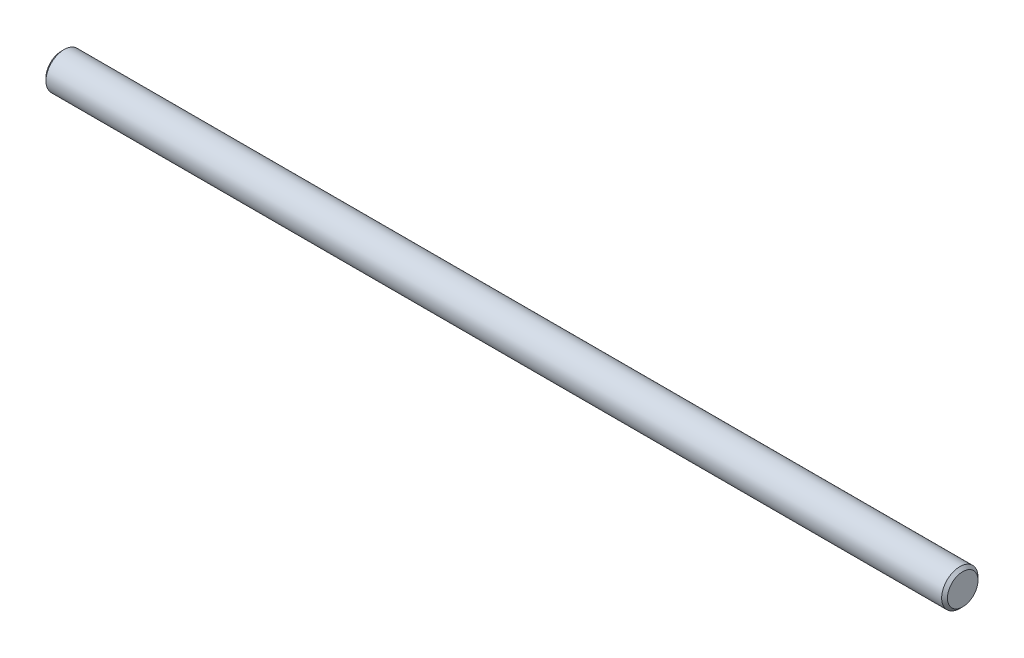
ISO-10303-21;
HEADER;
FILE_DESCRIPTION(('STEP AP214'),'2;1');
FILE_NAME('part.step','',(''),(''),'','','');
FILE_SCHEMA(('AUTOMOTIVE_DESIGN { 1 0 10303 214 1 1 1 1 }'));
ENDSEC;
DATA;
#1=APPLICATION_CONTEXT('core data for automotive mechanical design processes');
#2=APPLICATION_PROTOCOL_DEFINITION('international standard','automotive_design',2000,#1);
#3=PRODUCT_CONTEXT('',#1,'mechanical');
#4=PRODUCT('Part','Part','',(#3));
#5=PRODUCT_RELATED_PRODUCT_CATEGORY('part','',(#4));
#6=PRODUCT_DEFINITION_FORMATION('','',#4);
#7=PRODUCT_DEFINITION_CONTEXT('part definition',#1,'design');
#8=PRODUCT_DEFINITION('design','',#6,#7);
#9=PRODUCT_DEFINITION_SHAPE('','',#8);
#10=(LENGTH_UNIT() NAMED_UNIT(*) SI_UNIT(.MILLI.,.METRE.));
#11=(NAMED_UNIT(*) PLANE_ANGLE_UNIT() SI_UNIT($,.RADIAN.));
#12=(NAMED_UNIT(*) SI_UNIT($,.STERADIAN.) SOLID_ANGLE_UNIT());
#13=UNCERTAINTY_MEASURE_WITH_UNIT(LENGTH_MEASURE(1.E-05),#10,'distance_accuracy_value','');
#14=(GEOMETRIC_REPRESENTATION_CONTEXT(3) GLOBAL_UNCERTAINTY_ASSIGNED_CONTEXT((#13)) GLOBAL_UNIT_ASSIGNED_CONTEXT((#10,
#11,#12)) REPRESENTATION_CONTEXT('',''));
#15=CARTESIAN_POINT('',(0.,0.,0.));
#16=DIRECTION('',(0.,0.,1.));
#17=DIRECTION('',(1.,0.,0.));
#18=AXIS2_PLACEMENT_3D('',#15,#16,#17);
#19=CARTESIAN_POINT('',(310.,0.,0.));
#20=DIRECTION('',(-1.,0.,0.));
#21=DIRECTION('',(0.,0.,1.));
#22=AXIS2_PLACEMENT_3D('',#19,#20,#21);
#23=CYLINDRICAL_SURFACE('',#22,12.5);
#24=CARTESIAN_POINT('',(-308.,0.,0.));
#25=DIRECTION('',(1.,0.,0.));
#26=DIRECTION('',(0.,0.,-1.));
#27=AXIS2_PLACEMENT_3D('',#24,#25,#26);
#28=CIRCLE('',#27,12.5);
#29=CARTESIAN_POINT('',(-308.,0.,-12.5));
#30=VERTEX_POINT('',#29);
#31=EDGE_CURVE('E57',#30,#30,#28,.T.);
#32=ORIENTED_EDGE('',*,*,#31,.T.);
#33=EDGE_LOOP('',(#32));
#34=FACE_BOUND('',#33,.T.);
#35=CARTESIAN_POINT('',(308.,0.,0.));
#36=DIRECTION('',(1.,0.,0.));
#37=DIRECTION('',(0.,0.,-1.));
#38=AXIS2_PLACEMENT_3D('',#35,#36,#37);
#39=CIRCLE('',#38,12.5);
#40=CARTESIAN_POINT('',(308.,0.,-12.5));
#41=VERTEX_POINT('',#40);
#42=EDGE_CURVE('E62',#41,#41,#39,.F.);
#43=ORIENTED_EDGE('',*,*,#42,.T.);
#44=EDGE_LOOP('',(#43));
#45=FACE_BOUND('',#44,.T.);
#46=ADVANCED_FACE('F43',(#34,#45),#23,.T.);
#47=CARTESIAN_POINT('',(310.,0.,0.));
#48=DIRECTION('',(1.,0.,0.));
#49=DIRECTION('',(0.,0.,-1.));
#50=AXIS2_PLACEMENT_3D('',#47,#48,#49);
#51=PLANE('',#50);
#52=CARTESIAN_POINT('',(310.,0.,0.));
#53=DIRECTION('',(1.,0.,0.));
#54=DIRECTION('',(0.,0.,-1.));
#55=AXIS2_PLACEMENT_3D('',#52,#53,#54);
#56=CIRCLE('',#55,10.4999999999999);
#57=CARTESIAN_POINT('',(310.,0.,-10.4999999999999));
#58=VERTEX_POINT('',#57);
#59=EDGE_CURVE('E10',#58,#58,#56,.T.);
#60=ORIENTED_EDGE('',*,*,#59,.T.);
#61=EDGE_LOOP('',(#60));
#62=FACE_BOUND('',#61,.T.);
#63=ADVANCED_FACE('F79',(#62),#51,.T.);
#64=CARTESIAN_POINT('',(-310.,0.,0.));
#65=DIRECTION('',(1.,0.,0.));
#66=DIRECTION('',(0.,0.,-1.));
#67=AXIS2_PLACEMENT_3D('',#64,#65,#66);
#68=PLANE('',#67);
#69=CARTESIAN_POINT('',(-310.,0.,0.));
#70=DIRECTION('',(1.,0.,0.));
#71=DIRECTION('',(0.,0.,-1.));
#72=AXIS2_PLACEMENT_3D('',#69,#70,#71);
#73=CIRCLE('',#72,10.5000000000002);
#74=CARTESIAN_POINT('',(-310.,0.,-10.5000000000002));
#75=VERTEX_POINT('',#74);
#76=EDGE_CURVE('E52',#75,#75,#73,.F.);
#77=ORIENTED_EDGE('',*,*,#76,.T.);
#78=EDGE_LOOP('',(#77));
#79=FACE_BOUND('',#78,.T.);
#80=ADVANCED_FACE('F76',(#79),#68,.F.);
#81=CARTESIAN_POINT('',(-308.,0.,0.));
#82=DIRECTION('',(1.,0.,0.));
#83=DIRECTION('',(0.,0.,-1.));
#84=AXIS2_PLACEMENT_3D('',#81,#82,#83);
#85=CONICAL_SURFACE('',#84,12.5,0.78539816339746);
#86=ORIENTED_EDGE('',*,*,#76,.F.);
#87=EDGE_LOOP('',(#86));
#88=FACE_BOUND('',#87,.T.);
#89=ORIENTED_EDGE('',*,*,#31,.F.);
#90=EDGE_LOOP('',(#89));
#91=FACE_BOUND('',#90,.T.);
#92=ADVANCED_FACE('F72',(#88,#91),#85,.T.);
#93=CARTESIAN_POINT('',(310.,0.,0.));
#94=DIRECTION('',(-1.,0.,0.));
#95=DIRECTION('',(0.,0.,1.));
#96=AXIS2_PLACEMENT_3D('',#93,#94,#95);
#97=CONICAL_SURFACE('',#96,10.4999999999999,0.785398163397446);
#98=ORIENTED_EDGE('',*,*,#42,.F.);
#99=EDGE_LOOP('',(#98));
#100=FACE_BOUND('',#99,.T.);
#101=ORIENTED_EDGE('',*,*,#59,.F.);
#102=EDGE_LOOP('',(#101));
#103=FACE_BOUND('',#102,.T.);
#104=ADVANCED_FACE('F46',(#100,#103),#97,.T.);
#105=CLOSED_SHELL('',(#46,#63,#80,#92,#104));
#106=MANIFOLD_SOLID_BREP('B2',#105);
#107=ADVANCED_BREP_SHAPE_REPRESENTATION('',(#18,#106),#14);
#108=SHAPE_DEFINITION_REPRESENTATION(#9,#107);
ENDSEC;
END-ISO-10303-21;
